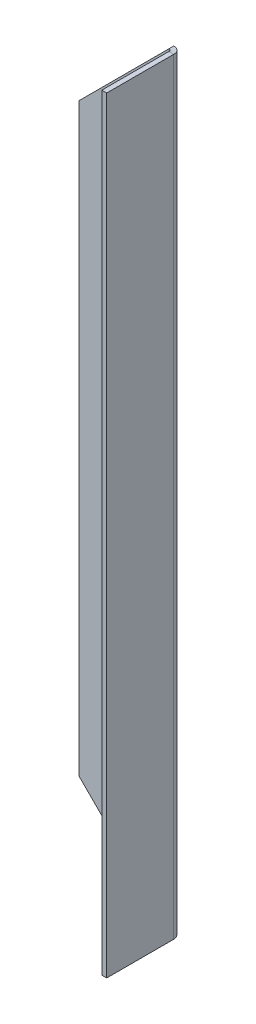
ISO-10303-21;
HEADER;
FILE_DESCRIPTION(('STEP AP214'),'2;1');
FILE_NAME('part.step','',(''),(''),'','','');
FILE_SCHEMA(('AUTOMOTIVE_DESIGN { 1 0 10303 214 1 1 1 1 }'));
ENDSEC;
DATA;
#1=APPLICATION_CONTEXT('core data for automotive mechanical design processes');
#2=APPLICATION_PROTOCOL_DEFINITION('international standard','automotive_design',2000,#1);
#3=PRODUCT_CONTEXT('',#1,'mechanical');
#4=PRODUCT('Part','Part','',(#3));
#5=PRODUCT_RELATED_PRODUCT_CATEGORY('part','',(#4));
#6=PRODUCT_DEFINITION_FORMATION('','',#4);
#7=PRODUCT_DEFINITION_CONTEXT('part definition',#1,'design');
#8=PRODUCT_DEFINITION('design','',#6,#7);
#9=PRODUCT_DEFINITION_SHAPE('','',#8);
#10=(LENGTH_UNIT() NAMED_UNIT(*) SI_UNIT(.MILLI.,.METRE.));
#11=(NAMED_UNIT(*) PLANE_ANGLE_UNIT() SI_UNIT($,.RADIAN.));
#12=(NAMED_UNIT(*) SI_UNIT($,.STERADIAN.) SOLID_ANGLE_UNIT());
#13=UNCERTAINTY_MEASURE_WITH_UNIT(LENGTH_MEASURE(1.E-05),#10,'distance_accuracy_value','');
#14=(GEOMETRIC_REPRESENTATION_CONTEXT(3) GLOBAL_UNCERTAINTY_ASSIGNED_CONTEXT((#13)) GLOBAL_UNIT_ASSIGNED_CONTEXT((#10,
#11,#12)) REPRESENTATION_CONTEXT('',''));
#15=CARTESIAN_POINT('',(0.,0.,0.));
#16=DIRECTION('',(0.,0.,1.));
#17=DIRECTION('',(1.,0.,0.));
#18=AXIS2_PLACEMENT_3D('',#15,#16,#17);
#19=CARTESIAN_POINT('',(-120.959621192985,-120.,21.5000000000012));
#20=DIRECTION('',(0.,0.,-1.));
#21=DIRECTION('',(-1.,0.,0.));
#22=AXIS2_PLACEMENT_3D('',#19,#20,#21);
#23=PLANE('',#22);
#24=DIRECTION('',(1.,0.,0.));
#25=VECTOR('',#24,1.);
#26=CARTESIAN_POINT('',(-120.959621192985,-116.792893218813,21.5000000000012));
#27=LINE('',#26,#25);
#28=CARTESIAN_POINT('',(348.5,-116.792893218813,21.5));
#29=VERTEX_POINT('',#28);
#30=CARTESIAN_POINT('',(350.,-116.792893218813,21.5));
#31=VERTEX_POINT('',#30);
#32=EDGE_CURVE('E213',#29,#31,#27,.T.);
#33=ORIENTED_EDGE('',*,*,#32,.T.);
#34=DIRECTION('',(0.,1.,0.));
#35=VECTOR('',#34,1.);
#36=CARTESIAN_POINT('',(350.,0.,21.5));
#37=LINE('',#36,#35);
#38=CARTESIAN_POINT('',(350.,117.792893218813,21.5));
#39=VERTEX_POINT('',#38);
#40=EDGE_CURVE('E190',#31,#39,#37,.T.);
#41=ORIENTED_EDGE('',*,*,#40,.T.);
#42=DIRECTION('',(1.,0.,0.));
#43=VECTOR('',#42,1.);
#44=CARTESIAN_POINT('',(-120.959621192985,117.792893218813,21.5000000000011));
#45=LINE('',#44,#43);
#46=CARTESIAN_POINT('',(348.5,117.792893218813,21.4999999999999));
#47=VERTEX_POINT('',#46);
#48=EDGE_CURVE('E182',#47,#39,#45,.T.);
#49=ORIENTED_EDGE('',*,*,#48,.F.);
#50=DIRECTION('',(0.,1.,0.));
#51=VECTOR('',#50,1.);
#52=CARTESIAN_POINT('',(348.5,-120.,21.5));
#53=LINE('',#52,#51);
#54=EDGE_CURVE('E229',#29,#47,#53,.T.);
#55=ORIENTED_EDGE('',*,*,#54,.F.);
#56=EDGE_LOOP('',(#33,#41,#49,#55));
#57=FACE_BOUND('',#56,.T.);
#58=ADVANCED_FACE('F65',(#57),#23,.F.);
#59=CARTESIAN_POINT('',(-120.959621192985,-116.792893218813,1.16573417585641E-12));
#60=DIRECTION('',(0.,-1.,0.));
#61=DIRECTION('',(0.,0.,1.));
#62=AXIS2_PLACEMENT_3D('',#59,#60,#61);
#63=PLANE('',#62);
#64=DIRECTION('',(0.,0.,1.));
#65=VECTOR('',#64,1.);
#66=CARTESIAN_POINT('',(350.,-116.792893218813,-9.43689570931383E-13));
#67=LINE('',#66,#65);
#68=CARTESIAN_POINT('',(350.,-116.792893218813,1.00000000000009));
#69=VERTEX_POINT('',#68);
#70=EDGE_CURVE('E174',#69,#31,#67,.T.);
#71=ORIENTED_EDGE('',*,*,#70,.T.);
#72=ORIENTED_EDGE('',*,*,#32,.F.);
#73=DIRECTION('',(0.,0.,-1.));
#74=VECTOR('',#73,1.);
#75=CARTESIAN_POINT('',(348.5,-116.792893218813,0.));
#76=LINE('',#75,#74);
#77=CARTESIAN_POINT('',(348.5,-116.792893218813,0.999999999999945));
#78=VERTEX_POINT('',#77);
#79=EDGE_CURVE('E125',#29,#78,#76,.T.);
#80=ORIENTED_EDGE('',*,*,#79,.T.);
#81=CARTESIAN_POINT('',(350.,-116.792893218813,1.00000000000009));
#82=CARTESIAN_POINT('',(348.5,-116.792893218813,1.00000000000002));
#83=B_SPLINE_CURVE_WITH_KNOTS('',1,(#81,#82),.UNSPECIFIED.,.F.,.F.,(2,2),(0.,1.),.UNSPECIFIED.);
#84=EDGE_CURVE('E171',#78,#69,#83,.F.);
#85=ORIENTED_EDGE('',*,*,#84,.T.);
#86=EDGE_LOOP('',(#71,#72,#80,#85));
#87=FACE_BOUND('',#86,.T.);
#88=ADVANCED_FACE('F173',(#87),#63,.T.);
#89=CARTESIAN_POINT('',(350.,0.,-9.43689570931383E-13));
#90=DIRECTION('',(-1.,0.,0.));
#91=DIRECTION('',(0.,0.,1.));
#92=AXIS2_PLACEMENT_3D('',#89,#90,#91);
#93=PLANE('',#92);
#94=DIRECTION('',(0.,0.,1.));
#95=VECTOR('',#94,1.);
#96=CARTESIAN_POINT('',(350.,117.792893218813,-9.43689570931383E-13));
#97=LINE('',#96,#95);
#98=CARTESIAN_POINT('',(350.,117.792893218813,0.999999999999945));
#99=VERTEX_POINT('',#98);
#100=EDGE_CURVE('E226',#39,#99,#97,.F.);
#101=ORIENTED_EDGE('',*,*,#100,.F.);
#102=ORIENTED_EDGE('',*,*,#40,.F.);
#103=ORIENTED_EDGE('',*,*,#70,.F.);
#104=DIRECTION('',(0.,1.,0.));
#105=VECTOR('',#104,1.);
#106=CARTESIAN_POINT('',(350.,117.792893218813,1.));
#107=LINE('',#106,#105);
#108=EDGE_CURVE('E188',#99,#69,#107,.F.);
#109=ORIENTED_EDGE('',*,*,#108,.F.);
#110=EDGE_LOOP('',(#101,#102,#103,#109));
#111=FACE_BOUND('',#110,.T.);
#112=ADVANCED_FACE('F186',(#111),#93,.F.);
#113=CARTESIAN_POINT('',(-120.959621192985,117.792893218814,1.16573417585641E-12));
#114=DIRECTION('',(0.,-1.,0.));
#115=DIRECTION('',(0.,0.,1.));
#116=AXIS2_PLACEMENT_3D('',#113,#114,#115);
#117=PLANE('',#116);
#118=ORIENTED_EDGE('',*,*,#48,.T.);
#119=ORIENTED_EDGE('',*,*,#100,.T.);
#120=CARTESIAN_POINT('',(348.5,117.792893218813,1.00000000000001));
#121=CARTESIAN_POINT('',(350.,117.792893218813,1.00000000000003));
#122=B_SPLINE_CURVE_WITH_KNOTS('',1,(#120,#121),.UNSPECIFIED.,.F.,.F.,(2,2),(0.,1.),.UNSPECIFIED.);
#123=CARTESIAN_POINT('',(348.5,117.792893218813,0.999999999999945));
#124=VERTEX_POINT('',#123);
#125=EDGE_CURVE('E116',#124,#99,#122,.T.);
#126=ORIENTED_EDGE('',*,*,#125,.F.);
#127=DIRECTION('',(0.,0.,-1.));
#128=VECTOR('',#127,1.);
#129=CARTESIAN_POINT('',(348.5,117.792893218813,0.));
#130=LINE('',#129,#128);
#131=EDGE_CURVE('E79',#47,#124,#130,.T.);
#132=ORIENTED_EDGE('',*,*,#131,.F.);
#133=EDGE_LOOP('',(#118,#119,#126,#132));
#134=FACE_BOUND('',#133,.T.);
#135=ADVANCED_FACE('F235',(#134),#117,.F.);
#136=CARTESIAN_POINT('',(348.5,0.,-9.43689570931383E-13));
#137=DIRECTION('',(-1.,0.,0.));
#138=DIRECTION('',(0.,0.,1.));
#139=AXIS2_PLACEMENT_3D('',#136,#137,#138);
#140=PLANE('',#139);
#141=ORIENTED_EDGE('',*,*,#79,.F.);
#142=ORIENTED_EDGE('',*,*,#54,.T.);
#143=ORIENTED_EDGE('',*,*,#131,.T.);
#144=DIRECTION('',(0.,1.,0.));
#145=VECTOR('',#144,1.);
#146=CARTESIAN_POINT('',(348.5,117.792893218813,1.));
#147=LINE('',#146,#145);
#148=EDGE_CURVE('E14',#124,#78,#147,.F.);
#149=ORIENTED_EDGE('',*,*,#148,.T.);
#150=EDGE_LOOP('',(#141,#142,#143,#149));
#151=FACE_BOUND('',#150,.T.);
#152=ADVANCED_FACE('F68',(#151),#140,.T.);
#153=CARTESIAN_POINT('',(0.,0.,-1.5));
#154=DIRECTION('',(0.,0.,-1.));
#155=DIRECTION('',(-1.,0.,0.));
#156=AXIS2_PLACEMENT_3D('',#153,#154,#155);
#157=PLANE('',#156);
#158=DIRECTION('',(0.,1.,0.));
#159=VECTOR('',#158,1.);
#160=CARTESIAN_POINT('',(320.,0.,-1.5));
#161=LINE('',#160,#159);
#162=CARTESIAN_POINT('',(320.,-89.0000000000001,-1.5));
#163=VERTEX_POINT('',#162);
#164=CARTESIAN_POINT('',(320.,90.0000000000001,-1.5));
#165=VERTEX_POINT('',#164);
#166=EDGE_CURVE('E204',#163,#165,#161,.T.);
#167=ORIENTED_EDGE('',*,*,#166,.T.);
#168=DIRECTION('',(0.707106781186548,0.707106781186547,0.));
#169=VECTOR('',#168,1.);
#170=CARTESIAN_POINT('',(115.,-115.,-1.5));
#171=LINE('',#170,#169);
#172=CARTESIAN_POINT('',(347.5,117.5,-1.5));
#173=VERTEX_POINT('',#172);
#174=EDGE_CURVE('E135',#165,#173,#171,.T.);
#175=ORIENTED_EDGE('',*,*,#174,.T.);
#176=DIRECTION('',(0.,1.,0.));
#177=VECTOR('',#176,1.);
#178=CARTESIAN_POINT('',(347.5,0.,-1.5));
#179=LINE('',#178,#177);
#180=CARTESIAN_POINT('',(347.5,-116.5,-1.5));
#181=VERTEX_POINT('',#180);
#182=EDGE_CURVE('E274',#173,#181,#179,.F.);
#183=ORIENTED_EDGE('',*,*,#182,.T.);
#184=DIRECTION('',(0.707106781186548,-0.707106781186547,0.));
#185=VECTOR('',#184,1.);
#186=CARTESIAN_POINT('',(115.,116.,-1.5));
#187=LINE('',#186,#185);
#188=EDGE_CURVE('E288',#163,#181,#187,.T.);
#189=ORIENTED_EDGE('',*,*,#188,.F.);
#190=EDGE_LOOP('',(#167,#175,#183,#189));
#191=FACE_BOUND('',#190,.T.);
#192=ADVANCED_FACE('F258',(#191),#157,.T.);
#193=CARTESIAN_POINT('',(115.,-115.,469.720755060725));
#194=DIRECTION('',(-0.707106781186547,0.707106781186548,0.));
#195=DIRECTION('',(-0.707106781186548,-0.707106781186547,0.));
#196=AXIS2_PLACEMENT_3D('',#193,#194,#195);
#197=PLANE('',#196);
#198=CARTESIAN_POINT('',(347.5,117.5,-1.49999999999998));
#199=CARTESIAN_POINT('',(347.5,117.5,0.));
#200=B_SPLINE_CURVE_WITH_KNOTS('',1,(#198,#199),.UNSPECIFIED.,.F.,.F.,(2,2),(0.,1.),.UNSPECIFIED.);
#201=CARTESIAN_POINT('',(347.5,117.5,0.));
#202=VERTEX_POINT('',#201);
#203=EDGE_CURVE('E387',#202,#173,#200,.F.);
#204=ORIENTED_EDGE('',*,*,#203,.T.);
#205=ORIENTED_EDGE('',*,*,#174,.F.);
#206=DIRECTION('',(0.,0.,-1.));
#207=VECTOR('',#206,1.);
#208=CARTESIAN_POINT('',(320.,90.0000000000001,469.720755060725));
#209=LINE('',#208,#207);
#210=CARTESIAN_POINT('',(320.,90.0000000000001,0.));
#211=VERTEX_POINT('',#210);
#212=EDGE_CURVE('E220',#211,#165,#209,.T.);
#213=ORIENTED_EDGE('',*,*,#212,.F.);
#214=DIRECTION('',(0.707106781186548,0.707106781186547,0.));
#215=VECTOR('',#214,1.);
#216=CARTESIAN_POINT('',(115.,-115.,0.));
#217=LINE('',#216,#215);
#218=EDGE_CURVE('E376',#211,#202,#217,.T.);
#219=ORIENTED_EDGE('',*,*,#218,.T.);
#220=EDGE_LOOP('',(#204,#205,#213,#219));
#221=FACE_BOUND('',#220,.T.);
#222=ADVANCED_FACE('F253',(#221),#197,.T.);
#223=CARTESIAN_POINT('',(320.,-90.0000000000001,469.720755060725));
#224=DIRECTION('',(1.,0.,0.));
#225=DIRECTION('',(0.,0.,-1.));
#226=AXIS2_PLACEMENT_3D('',#223,#224,#225);
#227=PLANE('',#226);
#228=ORIENTED_EDGE('',*,*,#166,.F.);
#229=DIRECTION('',(0.,0.,-1.));
#230=VECTOR('',#229,1.);
#231=CARTESIAN_POINT('',(320.,-89.0000000000001,469.720755060725));
#232=LINE('',#231,#230);
#233=CARTESIAN_POINT('',(320.,-89.0000000000001,0.));
#234=VERTEX_POINT('',#233);
#235=EDGE_CURVE('E377',#234,#163,#232,.T.);
#236=ORIENTED_EDGE('',*,*,#235,.F.);
#237=DIRECTION('',(0.,1.,0.));
#238=VECTOR('',#237,1.);
#239=CARTESIAN_POINT('',(320.,-90.0000000000001,0.));
#240=LINE('',#239,#238);
#241=EDGE_CURVE('E147',#211,#234,#240,.F.);
#242=ORIENTED_EDGE('',*,*,#241,.F.);
#243=ORIENTED_EDGE('',*,*,#212,.T.);
#244=EDGE_LOOP('',(#228,#236,#242,#243));
#245=FACE_BOUND('',#244,.T.);
#246=ADVANCED_FACE('F257',(#245),#227,.F.);
#247=CARTESIAN_POINT('',(115.,116.,469.720755060725));
#248=DIRECTION('',(0.707106781186547,0.707106781186548,0.));
#249=DIRECTION('',(-0.707106781186548,0.707106781186547,0.));
#250=AXIS2_PLACEMENT_3D('',#247,#248,#249);
#251=PLANE('',#250);
#252=ORIENTED_EDGE('',*,*,#188,.T.);
#253=CARTESIAN_POINT('',(347.5,-116.5,0.));
#254=CARTESIAN_POINT('',(347.5,-116.5,-1.50000000000001));
#255=B_SPLINE_CURVE_WITH_KNOTS('',1,(#253,#254),.UNSPECIFIED.,.F.,.F.,(2,2),(0.,1.),.UNSPECIFIED.);
#256=CARTESIAN_POINT('',(347.5,-116.5,0.));
#257=VERTEX_POINT('',#256);
#258=EDGE_CURVE('E198',#257,#181,#255,.T.);
#259=ORIENTED_EDGE('',*,*,#258,.F.);
#260=DIRECTION('',(0.707106781186548,-0.707106781186547,0.));
#261=VECTOR('',#260,1.);
#262=CARTESIAN_POINT('',(115.,116.,0.));
#263=LINE('',#262,#261);
#264=EDGE_CURVE('E375',#234,#257,#263,.T.);
#265=ORIENTED_EDGE('',*,*,#264,.F.);
#266=ORIENTED_EDGE('',*,*,#235,.T.);
#267=EDGE_LOOP('',(#252,#259,#265,#266));
#268=FACE_BOUND('',#267,.T.);
#269=ADVANCED_FACE('F299',(#268),#251,.F.);
#270=CARTESIAN_POINT('',(0.,0.,0.));
#271=DIRECTION('',(0.,0.,-1.));
#272=DIRECTION('',(-1.,0.,0.));
#273=AXIS2_PLACEMENT_3D('',#270,#271,#272);
#274=PLANE('',#273);
#275=ORIENTED_EDGE('',*,*,#218,.F.);
#276=ORIENTED_EDGE('',*,*,#241,.T.);
#277=ORIENTED_EDGE('',*,*,#264,.T.);
#278=DIRECTION('',(0.,1.,0.));
#279=VECTOR('',#278,1.);
#280=CARTESIAN_POINT('',(347.5,0.,0.));
#281=LINE('',#280,#279);
#282=EDGE_CURVE('E383',#202,#257,#281,.F.);
#283=ORIENTED_EDGE('',*,*,#282,.F.);
#284=EDGE_LOOP('',(#275,#276,#277,#283));
#285=FACE_BOUND('',#284,.T.);
#286=ADVANCED_FACE('F308',(#285),#274,.F.);
#287=CARTESIAN_POINT('',(350.,-116.792893218813,1.00000000000009));
#288=CARTESIAN_POINT('',(350.,-116.76848107427,0.672692089510702));
#289=CARTESIAN_POINT('',(349.934931691671,-116.744077682345,0.345630289101888));
#290=CARTESIAN_POINT('',(349.684465970886,-116.695262145876,-0.259047450927173));
#291=CARTESIAN_POINT('',(349.499167105996,-116.670854377641,-0.53636679993722));
#292=CARTESIAN_POINT('',(349.036366799937,-116.622038841172,-0.999167105995402));
#293=CARTESIAN_POINT('',(348.759047450927,-116.597631072938,-1.18446597088561));
#294=CARTESIAN_POINT('',(348.154369710898,-116.548815536469,-1.43493169167077));
#295=CARTESIAN_POINT('',(347.82730791049,-116.524412144544,-1.5));
#296=CARTESIAN_POINT('',(347.5,-116.5,-1.50000000000001));
#297=CARTESIAN_POINT('',(348.5,-116.792893218813,1.00000000000002));
#298=CARTESIAN_POINT('',(348.5,-116.768481197786,0.86907749822478));
#299=CARTESIAN_POINT('',(348.473972676668,-116.744077682345,0.738252115640744));
#300=CARTESIAN_POINT('',(348.373786388354,-116.695262145876,0.496381019629123));
#301=CARTESIAN_POINT('',(348.299666842398,-116.670854377641,0.385453280025105));
#302=CARTESIAN_POINT('',(348.114546719975,-116.622038841172,0.200333157601834));
#303=CARTESIAN_POINT('',(348.003618980371,-116.597631072938,0.126213611645752));
#304=CARTESIAN_POINT('',(347.761747884359,-116.548815536469,0.0260273233316859));
#305=CARTESIAN_POINT('',(347.630922501775,-116.524412021028,0.));
#306=CARTESIAN_POINT('',(347.5,-116.5,0.));
#307=B_SPLINE_SURFACE_WITH_KNOTS('',1,3,((#287,#288,#289,#290,#291,#292,#293,#294,#295,#296),
(#297,#298,#299,#300,#301,#302,#303,#304,#305,#306)),.UNSPECIFIED.,.F.,.F.,.F.,(2,2),(4,2,2,2,
4),(0.,1.),(0.,0.25,0.5,0.75,1.),.UNSPECIFIED.);
#308=CARTESIAN_POINT('',(348.5,-116.792893218813,1.00000000000002));
#309=CARTESIAN_POINT('',(348.5,-116.768481197786,0.86907749822478));
#310=CARTESIAN_POINT('',(348.473972676668,-116.744077682345,0.738252115640744));
#311=CARTESIAN_POINT('',(348.373786388354,-116.695262145876,0.496381019629123));
#312=CARTESIAN_POINT('',(348.299666842398,-116.670854377641,0.385453280025105));
#313=CARTESIAN_POINT('',(348.114546719975,-116.622038841172,0.200333157601834));
#314=CARTESIAN_POINT('',(348.003618980371,-116.597631072938,0.126213611645752));
#315=CARTESIAN_POINT('',(347.761747884359,-116.548815536469,0.0260273233316859));
#316=CARTESIAN_POINT('',(347.630922501775,-116.524412021028,0.));
#317=CARTESIAN_POINT('',(347.5,-116.5,0.));
#318=B_SPLINE_CURVE_WITH_KNOTS('',3,(#308,#309,#310,#311,#312,#313,#314,#315,#316,#317),
.UNSPECIFIED.,.F.,.F.,(4,2,2,2,4),(0.,0.25,0.5,0.75,1.),.UNSPECIFIED.);
#319=EDGE_CURVE('E409',#78,#257,#318,.T.);
#320=CARTESIAN_POINT('',(347.5,-116.5,-1.50000000000001));
#321=CARTESIAN_POINT('',(347.82730791049,-116.524412144544,-1.5));
#322=CARTESIAN_POINT('',(348.154369710898,-116.548815536469,-1.43493169167077));
#323=CARTESIAN_POINT('',(348.759047450927,-116.597631072938,-1.18446597088561));
#324=CARTESIAN_POINT('',(349.036366799937,-116.622038841172,-0.999167105995402));
#325=CARTESIAN_POINT('',(349.499167105996,-116.670854377641,-0.53636679993722));
#326=CARTESIAN_POINT('',(349.684465970886,-116.695262145876,-0.259047450927173));
#327=CARTESIAN_POINT('',(349.934931691671,-116.744077682345,0.345630289101888));
#328=CARTESIAN_POINT('',(350.,-116.76848107427,0.672692089510702));
#329=CARTESIAN_POINT('',(350.,-116.792893218813,1.00000000000009));
#330=B_SPLINE_CURVE_WITH_KNOTS('',3,(#320,#321,#322,#323,#324,#325,#326,#327,#328,#329),
.UNSPECIFIED.,.F.,.F.,(4,2,2,2,4),(0.,0.25,0.5,0.75,1.),.UNSPECIFIED.);
#331=EDGE_CURVE('E195',#69,#181,#330,.F.);
#332=ORIENTED_EDGE('',*,*,#84,.F.);
#333=ORIENTED_EDGE('',*,*,#319,.T.);
#334=ORIENTED_EDGE('',*,*,#258,.T.);
#335=ORIENTED_EDGE('',*,*,#331,.F.);
#336=EDGE_LOOP('',(#332,#333,#334,#335));
#337=FACE_BOUND('',#336,.T.);
#338=ADVANCED_FACE('F197',(#337),#307,.T.);
#339=CARTESIAN_POINT('',(347.5,117.5,-1.49999999999998));
#340=CARTESIAN_POINT('',(347.82730791049,117.524412144544,-1.49999999999997));
#341=CARTESIAN_POINT('',(348.154369710898,117.548815536469,-1.43493169167075));
#342=CARTESIAN_POINT('',(348.759047450927,117.597631072938,-1.18446597088559));
#343=CARTESIAN_POINT('',(349.036366799937,117.622038841172,-0.99916710599539));
#344=CARTESIAN_POINT('',(349.499167105996,117.670854377641,-0.536366799937226));
#345=CARTESIAN_POINT('',(349.684465970886,117.695262145876,-0.259047450927191));
#346=CARTESIAN_POINT('',(349.934931691671,117.744077682345,0.345630289101848));
#347=CARTESIAN_POINT('',(350.,117.76848107427,0.672692089510647));
#348=CARTESIAN_POINT('',(350.,117.792893218813,1.00000000000003));
#349=CARTESIAN_POINT('',(347.5,117.5,0.));
#350=CARTESIAN_POINT('',(347.630922501775,117.524412021028,0.));
#351=CARTESIAN_POINT('',(347.761747884359,117.548815536469,0.0260273233317114));
#352=CARTESIAN_POINT('',(348.003618980371,117.597631072938,0.126213611645772));
#353=CARTESIAN_POINT('',(348.114546719975,117.622038841172,0.20033315760185));
#354=CARTESIAN_POINT('',(348.299666842398,117.670854377641,0.385453280025114));
#355=CARTESIAN_POINT('',(348.373786388354,117.695262145876,0.496381019629128));
#356=CARTESIAN_POINT('',(348.473972676668,117.744077682345,0.738252115640742));
#357=CARTESIAN_POINT('',(348.5,117.768481197786,0.869077498224772));
#358=CARTESIAN_POINT('',(348.5,117.792893218813,1.00000000000001));
#359=B_SPLINE_SURFACE_WITH_KNOTS('',1,3,((#339,#340,#341,#342,#343,#344,#345,#346,#347,#348),
(#349,#350,#351,#352,#353,#354,#355,#356,#357,#358)),.UNSPECIFIED.,.F.,.F.,.F.,(2,2),(4,2,2,2,
4),(0.,1.),(0.,0.25,0.5,0.75,1.),.UNSPECIFIED.);
#360=CARTESIAN_POINT('',(347.5,117.5,0.));
#361=CARTESIAN_POINT('',(347.630922501775,117.524412021028,0.));
#362=CARTESIAN_POINT('',(347.761747884359,117.548815536469,0.0260273233317114));
#363=CARTESIAN_POINT('',(348.003618980371,117.597631072938,0.126213611645772));
#364=CARTESIAN_POINT('',(348.114546719975,117.622038841172,0.20033315760185));
#365=CARTESIAN_POINT('',(348.299666842398,117.670854377641,0.385453280025114));
#366=CARTESIAN_POINT('',(348.373786388354,117.695262145876,0.496381019629128));
#367=CARTESIAN_POINT('',(348.473972676668,117.744077682345,0.738252115640742));
#368=CARTESIAN_POINT('',(348.5,117.768481197786,0.869077498224772));
#369=CARTESIAN_POINT('',(348.5,117.792893218813,1.00000000000001));
#370=B_SPLINE_CURVE_WITH_KNOTS('',3,(#360,#361,#362,#363,#364,#365,#366,#367,#368,#369),
.UNSPECIFIED.,.F.,.F.,(4,2,2,2,4),(0.,0.25,0.5,0.75,1.),.UNSPECIFIED.);
#371=EDGE_CURVE('E424',#202,#124,#370,.T.);
#372=CARTESIAN_POINT('',(350.,117.792893218813,1.00000000000003));
#373=CARTESIAN_POINT('',(350.,117.76848107427,0.672692089510647));
#374=CARTESIAN_POINT('',(349.934931691671,117.744077682345,0.345630289101848));
#375=CARTESIAN_POINT('',(349.684465970886,117.695262145876,-0.259047450927191));
#376=CARTESIAN_POINT('',(349.499167105996,117.670854377641,-0.536366799937226));
#377=CARTESIAN_POINT('',(349.036366799937,117.622038841172,-0.99916710599539));
#378=CARTESIAN_POINT('',(348.759047450927,117.597631072938,-1.18446597088559));
#379=CARTESIAN_POINT('',(348.154369710898,117.548815536469,-1.43493169167075));
#380=CARTESIAN_POINT('',(347.82730791049,117.524412144544,-1.49999999999997));
#381=CARTESIAN_POINT('',(347.5,117.5,-1.49999999999998));
#382=B_SPLINE_CURVE_WITH_KNOTS('',3,(#372,#373,#374,#375,#376,#377,#378,#379,#380,#381),
.UNSPECIFIED.,.F.,.F.,(4,2,2,2,4),(0.,0.25,0.5,0.75,1.),.UNSPECIFIED.);
#383=EDGE_CURVE('E205',#173,#99,#382,.F.);
#384=ORIENTED_EDGE('',*,*,#203,.F.);
#385=ORIENTED_EDGE('',*,*,#371,.T.);
#386=ORIENTED_EDGE('',*,*,#125,.T.);
#387=ORIENTED_EDGE('',*,*,#383,.F.);
#388=EDGE_LOOP('',(#384,#385,#386,#387));
#389=FACE_BOUND('',#388,.T.);
#390=ADVANCED_FACE('F322',(#389),#359,.T.);
#391=CARTESIAN_POINT('',(347.5,-356.611008990105,0.999999999999945));
#392=DIRECTION('',(0.,1.,0.));
#393=DIRECTION('',(0.,0.,1.));
#394=AXIS2_PLACEMENT_3D('',#391,#392,#393);
#395=CYLINDRICAL_SURFACE('',#394,2.49999999999998);
#396=ORIENTED_EDGE('',*,*,#383,.T.);
#397=ORIENTED_EDGE('',*,*,#108,.T.);
#398=ORIENTED_EDGE('',*,*,#331,.T.);
#399=ORIENTED_EDGE('',*,*,#182,.F.);
#400=EDGE_LOOP('',(#396,#397,#398,#399));
#401=FACE_BOUND('',#400,.T.);
#402=ADVANCED_FACE('F209',(#401),#395,.T.);
#403=CARTESIAN_POINT('',(347.5,-356.611008990105,0.999999999999945));
#404=DIRECTION('',(0.,1.,0.));
#405=DIRECTION('',(0.,0.,1.));
#406=AXIS2_PLACEMENT_3D('',#403,#404,#405);
#407=CYLINDRICAL_SURFACE('',#406,0.999999999999982);
#408=ORIENTED_EDGE('',*,*,#371,.F.);
#409=ORIENTED_EDGE('',*,*,#282,.T.);
#410=ORIENTED_EDGE('',*,*,#319,.F.);
#411=ORIENTED_EDGE('',*,*,#148,.F.);
#412=EDGE_LOOP('',(#408,#409,#410,#411));
#413=FACE_BOUND('',#412,.T.);
#414=ADVANCED_FACE('F481',(#413),#407,.F.);
#415=CLOSED_SHELL('',(#58,#88,#112,#135,#152,#192,#222,#246,#269,#286,#338,#390,#402,#414));
#416=MANIFOLD_SOLID_BREP('B2',#415);
#417=ADVANCED_BREP_SHAPE_REPRESENTATION('',(#18,#416),#14);
#418=SHAPE_DEFINITION_REPRESENTATION(#9,#417);
ENDSEC;
END-ISO-10303-21;
